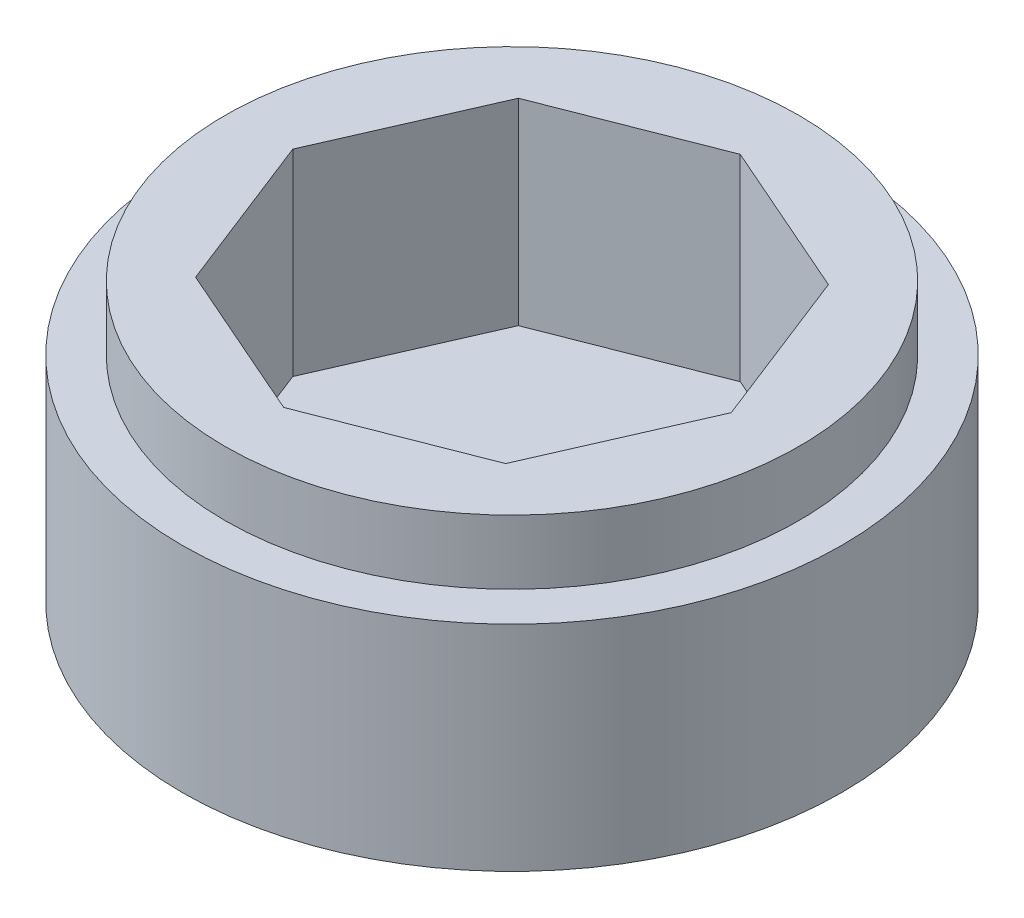
ISO-10303-21;
HEADER;
FILE_DESCRIPTION(('STEP AP214'),'2;1');
FILE_NAME('part.step','',(''),(''),'','','');
FILE_SCHEMA(('AUTOMOTIVE_DESIGN { 1 0 10303 214 1 1 1 1 }'));
ENDSEC;
DATA;
#1=APPLICATION_CONTEXT('core data for automotive mechanical design processes');
#2=APPLICATION_PROTOCOL_DEFINITION('international standard','automotive_design',2000,#1);
#3=PRODUCT_CONTEXT('',#1,'mechanical');
#4=PRODUCT('Part','Part','',(#3));
#5=PRODUCT_RELATED_PRODUCT_CATEGORY('part','',(#4));
#6=PRODUCT_DEFINITION_FORMATION('','',#4);
#7=PRODUCT_DEFINITION_CONTEXT('part definition',#1,'design');
#8=PRODUCT_DEFINITION('design','',#6,#7);
#9=PRODUCT_DEFINITION_SHAPE('','',#8);
#10=(LENGTH_UNIT() NAMED_UNIT(*) SI_UNIT(.MILLI.,.METRE.));
#11=(NAMED_UNIT(*) PLANE_ANGLE_UNIT() SI_UNIT($,.RADIAN.));
#12=(NAMED_UNIT(*) SI_UNIT($,.STERADIAN.) SOLID_ANGLE_UNIT());
#13=UNCERTAINTY_MEASURE_WITH_UNIT(LENGTH_MEASURE(1.E-05),#10,'distance_accuracy_value','');
#14=(GEOMETRIC_REPRESENTATION_CONTEXT(3) GLOBAL_UNCERTAINTY_ASSIGNED_CONTEXT((#13)) GLOBAL_UNIT_ASSIGNED_CONTEXT((#10,
#11,#12)) REPRESENTATION_CONTEXT('',''));
#15=CARTESIAN_POINT('',(0.,0.,0.));
#16=DIRECTION('',(0.,0.,1.));
#17=DIRECTION('',(1.,0.,0.));
#18=AXIS2_PLACEMENT_3D('',#15,#16,#17);
#19=CARTESIAN_POINT('',(0.,2.5,0.));
#20=DIRECTION('',(0.,-1.,0.));
#21=DIRECTION('',(0.,0.,-1.));
#22=AXIS2_PLACEMENT_3D('',#19,#20,#21);
#23=CYLINDRICAL_SURFACE('',#22,3.85);
#24=CARTESIAN_POINT('',(0.,2.5,0.));
#25=DIRECTION('',(0.,1.,0.));
#26=DIRECTION('',(0.,0.,1.));
#27=AXIS2_PLACEMENT_3D('',#24,#25,#26);
#28=CIRCLE('',#27,3.85);
#29=CARTESIAN_POINT('',(0.,2.5,3.85));
#30=VERTEX_POINT('',#29);
#31=EDGE_CURVE('E50',#30,#30,#28,.T.);
#32=ORIENTED_EDGE('',*,*,#31,.F.);
#33=EDGE_LOOP('',(#32));
#34=FACE_BOUND('',#33,.T.);
#35=CARTESIAN_POINT('',(0.,0.,0.));
#36=DIRECTION('',(0.,1.,0.));
#37=DIRECTION('',(0.,0.,1.));
#38=AXIS2_PLACEMENT_3D('',#35,#36,#37);
#39=CIRCLE('',#38,3.85);
#40=CARTESIAN_POINT('',(0.,0.,3.85));
#41=VERTEX_POINT('',#40);
#42=EDGE_CURVE('E44',#41,#41,#39,.T.);
#43=ORIENTED_EDGE('',*,*,#42,.T.);
#44=EDGE_LOOP('',(#43));
#45=FACE_BOUND('',#44,.T.);
#46=ADVANCED_FACE('F41',(#34,#45),#23,.T.);
#47=CARTESIAN_POINT('',(0.,2.5,0.));
#48=DIRECTION('',(0.,1.,0.));
#49=DIRECTION('',(0.,0.,1.));
#50=AXIS2_PLACEMENT_3D('',#47,#48,#49);
#51=PLANE('',#50);
#52=CARTESIAN_POINT('',(0.,2.5,0.));
#53=DIRECTION('',(0.,1.,0.));
#54=DIRECTION('',(0.,0.,1.));
#55=AXIS2_PLACEMENT_3D('',#52,#53,#54);
#56=CIRCLE('',#55,3.35);
#57=CARTESIAN_POINT('',(0.,2.5,3.35));
#58=VERTEX_POINT('',#57);
#59=EDGE_CURVE('E11',#58,#58,#56,.T.);
#60=ORIENTED_EDGE('',*,*,#59,.F.);
#61=EDGE_LOOP('',(#60));
#62=FACE_BOUND('',#61,.T.);
#63=ORIENTED_EDGE('',*,*,#31,.T.);
#64=EDGE_LOOP('',(#63));
#65=FACE_BOUND('',#64,.T.);
#66=ADVANCED_FACE('F207',(#62,#65),#51,.T.);
#67=CARTESIAN_POINT('',(0.,0.,0.));
#68=DIRECTION('',(0.,1.,0.));
#69=DIRECTION('',(0.,0.,1.));
#70=AXIS2_PLACEMENT_3D('',#67,#68,#69);
#71=PLANE('',#70);
#72=ORIENTED_EDGE('',*,*,#42,.F.);
#73=EDGE_LOOP('',(#72));
#74=FACE_BOUND('',#73,.T.);
#75=ADVANCED_FACE('F204',(#74),#71,.F.);
#76=CARTESIAN_POINT('',(0.,3.25,0.));
#77=DIRECTION('',(0.,-1.,0.));
#78=DIRECTION('',(0.,0.,-1.));
#79=AXIS2_PLACEMENT_3D('',#76,#77,#78);
#80=CYLINDRICAL_SURFACE('',#79,3.35);
#81=CARTESIAN_POINT('',(0.,3.25,0.));
#82=DIRECTION('',(0.,1.,0.));
#83=DIRECTION('',(0.,0.,1.));
#84=AXIS2_PLACEMENT_3D('',#81,#82,#83);
#85=CIRCLE('',#84,3.35);
#86=CARTESIAN_POINT('',(0.,3.25,3.35));
#87=VERTEX_POINT('',#86);
#88=EDGE_CURVE('E177',#87,#87,#85,.T.);
#89=ORIENTED_EDGE('',*,*,#88,.F.);
#90=EDGE_LOOP('',(#89));
#91=FACE_BOUND('',#90,.T.);
#92=ORIENTED_EDGE('',*,*,#59,.T.);
#93=EDGE_LOOP('',(#92));
#94=FACE_BOUND('',#93,.T.);
#95=ADVANCED_FACE('F206',(#91,#94),#80,.T.);
#96=CARTESIAN_POINT('',(0.,3.25,0.));
#97=DIRECTION('',(0.,1.,0.));
#98=DIRECTION('',(0.,0.,1.));
#99=AXIS2_PLACEMENT_3D('',#96,#97,#98);
#100=PLANE('',#99);
#101=DIRECTION('',(0.915986702905666,0.,0.401208624159561));
#102=VECTOR('',#101,1.);
#103=CARTESIAN_POINT('',(-1.88459000469273,3.25,1.81017889694871));
#104=LINE('',#103,#102);
#105=CARTESIAN_POINT('',(-1.88459000469273,3.25,1.81017889694871));
#106=VERTEX_POINT('',#105);
#107=CARTESIAN_POINT('',(-0.0526165988813971,3.25,2.61259614526784));
#108=VERTEX_POINT('',#107);
#109=EDGE_CURVE('E58',#106,#108,#104,.T.);
#110=ORIENTED_EDGE('',*,*,#109,.F.);
#111=DIRECTION('',(0.364003070287553,0.,0.931397747915054));
#112=VECTOR('',#111,1.);
#113=CARTESIAN_POINT('',(-2.61259614526784,3.25,-0.0526165988813964));
#114=LINE('',#113,#112);
#115=CARTESIAN_POINT('',(-2.61259614526784,3.25,-0.0526165988813964));
#116=VERTEX_POINT('',#115);
#117=EDGE_CURVE('E171',#116,#106,#114,.T.);
#118=ORIENTED_EDGE('',*,*,#117,.F.);
#119=DIRECTION('',(-0.401208624159561,0.,0.915986702905666));
#120=VECTOR('',#119,1.);
#121=CARTESIAN_POINT('',(-1.81017889694871,3.25,-1.88459000469273));
#122=LINE('',#121,#120);
#123=CARTESIAN_POINT('',(-1.81017889694871,3.25,-1.88459000469273));
#124=VERTEX_POINT('',#123);
#125=EDGE_CURVE('E168',#124,#116,#122,.T.);
#126=ORIENTED_EDGE('',*,*,#125,.F.);
#127=DIRECTION('',(-0.931397747915054,0.,0.364003070287554));
#128=VECTOR('',#127,1.);
#129=CARTESIAN_POINT('',(0.052616598881397,3.25,-2.61259614526784));
#130=LINE('',#129,#128);
#131=CARTESIAN_POINT('',(0.052616598881397,3.25,-2.61259614526784));
#132=VERTEX_POINT('',#131);
#133=EDGE_CURVE('E118',#132,#124,#130,.T.);
#134=ORIENTED_EDGE('',*,*,#133,.F.);
#135=DIRECTION('',(-0.915986702905666,0.,-0.401208624159561));
#136=VECTOR('',#135,1.);
#137=CARTESIAN_POINT('',(1.88459000469273,3.25,-1.81017889694871));
#138=LINE('',#137,#136);
#139=CARTESIAN_POINT('',(1.88459000469273,3.25,-1.81017889694871));
#140=VERTEX_POINT('',#139);
#141=EDGE_CURVE('E162',#140,#132,#138,.T.);
#142=ORIENTED_EDGE('',*,*,#141,.F.);
#143=DIRECTION('',(-0.364003070287553,0.,-0.931397747915054));
#144=VECTOR('',#143,1.);
#145=CARTESIAN_POINT('',(2.61259614526784,3.25,0.0526165988813964));
#146=LINE('',#145,#144);
#147=CARTESIAN_POINT('',(2.61259614526784,3.25,0.0526165988813964));
#148=VERTEX_POINT('',#147);
#149=EDGE_CURVE('E158',#148,#140,#146,.T.);
#150=ORIENTED_EDGE('',*,*,#149,.F.);
#151=DIRECTION('',(0.401208624159561,0.,-0.915986702905665));
#152=VECTOR('',#151,1.);
#153=CARTESIAN_POINT('',(1.81017889694871,3.25,1.88459000469273));
#154=LINE('',#153,#152);
#155=CARTESIAN_POINT('',(1.81017889694871,3.25,1.88459000469273));
#156=VERTEX_POINT('',#155);
#157=EDGE_CURVE('E154',#156,#148,#154,.T.);
#158=ORIENTED_EDGE('',*,*,#157,.F.);
#159=DIRECTION('',(0.931397747915054,0.,-0.364003070287553));
#160=VECTOR('',#159,1.);
#161=CARTESIAN_POINT('',(-0.0526165988813971,3.25,2.61259614526784));
#162=LINE('',#161,#160);
#163=EDGE_CURVE('E150',#108,#156,#162,.T.);
#164=ORIENTED_EDGE('',*,*,#163,.F.);
#165=EDGE_LOOP('',(#110,#118,#126,#134,#142,#150,#158,#164));
#166=FACE_BOUND('',#165,.T.);
#167=ORIENTED_EDGE('',*,*,#88,.T.);
#168=EDGE_LOOP('',(#167));
#169=FACE_BOUND('',#168,.T.);
#170=ADVANCED_FACE('F212',(#166,#169),#100,.T.);
#171=CARTESIAN_POINT('',(-1.88459000469273,0.95,1.81017889694871));
#172=DIRECTION('',(-0.401208624159561,0.,0.915986702905666));
#173=DIRECTION('',(0.915986702905666,0.,0.401208624159561));
#174=AXIS2_PLACEMENT_3D('',#171,#172,#173);
#175=PLANE('',#174);
#176=ORIENTED_EDGE('',*,*,#109,.T.);
#177=DIRECTION('',(0.,1.,0.));
#178=VECTOR('',#177,1.);
#179=CARTESIAN_POINT('',(-0.0526165988813971,0.95,2.61259614526784));
#180=LINE('',#179,#178);
#181=CARTESIAN_POINT('',(-0.0526165988813971,0.95,2.61259614526784));
#182=VERTEX_POINT('',#181);
#183=EDGE_CURVE('E94',#182,#108,#180,.T.);
#184=ORIENTED_EDGE('',*,*,#183,.F.);
#185=DIRECTION('',(0.915986702905666,0.,0.401208624159561));
#186=VECTOR('',#185,1.);
#187=CARTESIAN_POINT('',(-1.88459000469273,0.95,1.81017889694871));
#188=LINE('',#187,#186);
#189=CARTESIAN_POINT('',(-1.88459000469273,0.95,1.81017889694871));
#190=VERTEX_POINT('',#189);
#191=EDGE_CURVE('E174',#190,#182,#188,.T.);
#192=ORIENTED_EDGE('',*,*,#191,.F.);
#193=DIRECTION('',(0.,1.,0.));
#194=VECTOR('',#193,1.);
#195=CARTESIAN_POINT('',(-1.88459000469273,0.95,1.81017889694871));
#196=LINE('',#195,#194);
#197=EDGE_CURVE('E66',#190,#106,#196,.T.);
#198=ORIENTED_EDGE('',*,*,#197,.T.);
#199=EDGE_LOOP('',(#176,#184,#192,#198));
#200=FACE_BOUND('',#199,.T.);
#201=ADVANCED_FACE('F242',(#200),#175,.F.);
#202=CARTESIAN_POINT('',(-2.61259614526784,0.95,-0.0526165988813964));
#203=DIRECTION('',(-0.931397747915054,0.,0.364003070287553));
#204=DIRECTION('',(0.364003070287553,0.,0.931397747915054));
#205=AXIS2_PLACEMENT_3D('',#202,#203,#204);
#206=PLANE('',#205);
#207=ORIENTED_EDGE('',*,*,#117,.T.);
#208=ORIENTED_EDGE('',*,*,#197,.F.);
#209=DIRECTION('',(0.364003070287553,0.,0.931397747915054));
#210=VECTOR('',#209,1.);
#211=CARTESIAN_POINT('',(-2.61259614526784,0.95,-0.0526165988813964));
#212=LINE('',#211,#210);
#213=CARTESIAN_POINT('',(-2.61259614526784,0.95,-0.0526165988813964));
#214=VERTEX_POINT('',#213);
#215=EDGE_CURVE('E132',#214,#190,#212,.T.);
#216=ORIENTED_EDGE('',*,*,#215,.F.);
#217=DIRECTION('',(0.,1.,0.));
#218=VECTOR('',#217,1.);
#219=CARTESIAN_POINT('',(-2.61259614526784,0.95,-0.0526165988813964));
#220=LINE('',#219,#218);
#221=EDGE_CURVE('E123',#214,#116,#220,.T.);
#222=ORIENTED_EDGE('',*,*,#221,.T.);
#223=EDGE_LOOP('',(#207,#208,#216,#222));
#224=FACE_BOUND('',#223,.T.);
#225=ADVANCED_FACE('F252',(#224),#206,.F.);
#226=CARTESIAN_POINT('',(-1.81017889694871,0.95,-1.88459000469273));
#227=DIRECTION('',(-0.915986702905666,0.,-0.401208624159561));
#228=DIRECTION('',(-0.401208624159561,0.,0.915986702905666));
#229=AXIS2_PLACEMENT_3D('',#226,#227,#228);
#230=PLANE('',#229);
#231=ORIENTED_EDGE('',*,*,#125,.T.);
#232=ORIENTED_EDGE('',*,*,#221,.F.);
#233=DIRECTION('',(-0.401208624159561,0.,0.915986702905666));
#234=VECTOR('',#233,1.);
#235=CARTESIAN_POINT('',(-1.81017889694871,0.95,-1.88459000469273));
#236=LINE('',#235,#234);
#237=CARTESIAN_POINT('',(-1.81017889694871,0.95,-1.88459000469273));
#238=VERTEX_POINT('',#237);
#239=EDGE_CURVE('E127',#238,#214,#236,.T.);
#240=ORIENTED_EDGE('',*,*,#239,.F.);
#241=DIRECTION('',(0.,1.,0.));
#242=VECTOR('',#241,1.);
#243=CARTESIAN_POINT('',(-1.81017889694871,0.95,-1.88459000469273));
#244=LINE('',#243,#242);
#245=EDGE_CURVE('E111',#238,#124,#244,.T.);
#246=ORIENTED_EDGE('',*,*,#245,.T.);
#247=EDGE_LOOP('',(#231,#232,#240,#246));
#248=FACE_BOUND('',#247,.T.);
#249=ADVANCED_FACE('F128',(#248),#230,.F.);
#250=CARTESIAN_POINT('',(0.052616598881397,0.95,-2.61259614526784));
#251=DIRECTION('',(-0.364003070287554,0.,-0.931397747915054));
#252=DIRECTION('',(-0.931397747915054,0.,0.364003070287554));
#253=AXIS2_PLACEMENT_3D('',#250,#251,#252);
#254=PLANE('',#253);
#255=ORIENTED_EDGE('',*,*,#133,.T.);
#256=ORIENTED_EDGE('',*,*,#245,.F.);
#257=DIRECTION('',(-0.931397747915054,0.,0.364003070287554));
#258=VECTOR('',#257,1.);
#259=CARTESIAN_POINT('',(0.052616598881397,0.95,-2.61259614526784));
#260=LINE('',#259,#258);
#261=CARTESIAN_POINT('',(0.052616598881397,0.95,-2.61259614526784));
#262=VERTEX_POINT('',#261);
#263=EDGE_CURVE('E115',#262,#238,#260,.T.);
#264=ORIENTED_EDGE('',*,*,#263,.F.);
#265=DIRECTION('',(0.,1.,0.));
#266=VECTOR('',#265,1.);
#267=CARTESIAN_POINT('',(0.052616598881397,0.95,-2.61259614526784));
#268=LINE('',#267,#266);
#269=EDGE_CURVE('E124',#262,#132,#268,.T.);
#270=ORIENTED_EDGE('',*,*,#269,.T.);
#271=EDGE_LOOP('',(#255,#256,#264,#270));
#272=FACE_BOUND('',#271,.T.);
#273=ADVANCED_FACE('F113',(#272),#254,.F.);
#274=CARTESIAN_POINT('',(1.88459000469273,0.95,-1.81017889694871));
#275=DIRECTION('',(0.401208624159561,0.,-0.915986702905666));
#276=DIRECTION('',(-0.915986702905666,0.,-0.401208624159561));
#277=AXIS2_PLACEMENT_3D('',#274,#275,#276);
#278=PLANE('',#277);
#279=ORIENTED_EDGE('',*,*,#141,.T.);
#280=ORIENTED_EDGE('',*,*,#269,.F.);
#281=DIRECTION('',(-0.915986702905666,0.,-0.401208624159561));
#282=VECTOR('',#281,1.);
#283=CARTESIAN_POINT('',(1.88459000469273,0.95,-1.81017889694871));
#284=LINE('',#283,#282);
#285=CARTESIAN_POINT('',(1.88459000469273,0.95,-1.81017889694871));
#286=VERTEX_POINT('',#285);
#287=EDGE_CURVE('E138',#286,#262,#284,.T.);
#288=ORIENTED_EDGE('',*,*,#287,.F.);
#289=DIRECTION('',(0.,1.,0.));
#290=VECTOR('',#289,1.);
#291=CARTESIAN_POINT('',(1.88459000469273,0.95,-1.81017889694871));
#292=LINE('',#291,#290);
#293=EDGE_CURVE('E182',#286,#140,#292,.T.);
#294=ORIENTED_EDGE('',*,*,#293,.T.);
#295=EDGE_LOOP('',(#279,#280,#288,#294));
#296=FACE_BOUND('',#295,.T.);
#297=ADVANCED_FACE('F277',(#296),#278,.F.);
#298=CARTESIAN_POINT('',(2.61259614526784,0.95,0.0526165988813964));
#299=DIRECTION('',(0.931397747915054,0.,-0.364003070287553));
#300=DIRECTION('',(-0.364003070287553,0.,-0.931397747915054));
#301=AXIS2_PLACEMENT_3D('',#298,#299,#300);
#302=PLANE('',#301);
#303=ORIENTED_EDGE('',*,*,#149,.T.);
#304=ORIENTED_EDGE('',*,*,#293,.F.);
#305=DIRECTION('',(-0.364003070287553,0.,-0.931397747915054));
#306=VECTOR('',#305,1.);
#307=CARTESIAN_POINT('',(2.61259614526784,0.95,0.0526165988813964));
#308=LINE('',#307,#306);
#309=CARTESIAN_POINT('',(2.61259614526784,0.95,0.0526165988813964));
#310=VERTEX_POINT('',#309);
#311=EDGE_CURVE('E142',#310,#286,#308,.T.);
#312=ORIENTED_EDGE('',*,*,#311,.F.);
#313=DIRECTION('',(0.,1.,0.));
#314=VECTOR('',#313,1.);
#315=CARTESIAN_POINT('',(2.61259614526784,0.95,0.0526165988813964));
#316=LINE('',#315,#314);
#317=EDGE_CURVE('E185',#310,#148,#316,.T.);
#318=ORIENTED_EDGE('',*,*,#317,.T.);
#319=EDGE_LOOP('',(#303,#304,#312,#318));
#320=FACE_BOUND('',#319,.T.);
#321=ADVANCED_FACE('F286',(#320),#302,.F.);
#322=CARTESIAN_POINT('',(1.81017889694871,0.95,1.88459000469273));
#323=DIRECTION('',(0.915986702905666,0.,0.401208624159561));
#324=DIRECTION('',(0.401208624159561,0.,-0.915986702905666));
#325=AXIS2_PLACEMENT_3D('',#322,#323,#324);
#326=PLANE('',#325);
#327=ORIENTED_EDGE('',*,*,#157,.T.);
#328=ORIENTED_EDGE('',*,*,#317,.F.);
#329=DIRECTION('',(0.401208624159561,0.,-0.915986702905665));
#330=VECTOR('',#329,1.);
#331=CARTESIAN_POINT('',(1.81017889694871,0.95,1.88459000469273));
#332=LINE('',#331,#330);
#333=CARTESIAN_POINT('',(1.81017889694871,0.95,1.88459000469273));
#334=VERTEX_POINT('',#333);
#335=EDGE_CURVE('E336',#334,#310,#332,.T.);
#336=ORIENTED_EDGE('',*,*,#335,.F.);
#337=DIRECTION('',(0.,1.,0.));
#338=VECTOR('',#337,1.);
#339=CARTESIAN_POINT('',(1.81017889694871,0.95,1.88459000469273));
#340=LINE('',#339,#338);
#341=EDGE_CURVE('E188',#334,#156,#340,.T.);
#342=ORIENTED_EDGE('',*,*,#341,.T.);
#343=EDGE_LOOP('',(#327,#328,#336,#342));
#344=FACE_BOUND('',#343,.T.);
#345=ADVANCED_FACE('F296',(#344),#326,.F.);
#346=CARTESIAN_POINT('',(-0.0526165988813971,0.95,2.61259614526784));
#347=DIRECTION('',(0.364003070287553,0.,0.931397747915054));
#348=DIRECTION('',(0.931397747915054,0.,-0.364003070287553));
#349=AXIS2_PLACEMENT_3D('',#346,#347,#348);
#350=PLANE('',#349);
#351=ORIENTED_EDGE('',*,*,#163,.T.);
#352=ORIENTED_EDGE('',*,*,#341,.F.);
#353=DIRECTION('',(0.931397747915054,0.,-0.364003070287553));
#354=VECTOR('',#353,1.);
#355=CARTESIAN_POINT('',(-0.0526165988813971,0.95,2.61259614526784));
#356=LINE('',#355,#354);
#357=EDGE_CURVE('E339',#182,#334,#356,.T.);
#358=ORIENTED_EDGE('',*,*,#357,.F.);
#359=ORIENTED_EDGE('',*,*,#183,.T.);
#360=EDGE_LOOP('',(#351,#352,#358,#359));
#361=FACE_BOUND('',#360,.T.);
#362=ADVANCED_FACE('F306',(#361),#350,.F.);
#363=CARTESIAN_POINT('',(0.,0.95,0.));
#364=DIRECTION('',(0.,1.,0.));
#365=DIRECTION('',(0.,0.,1.));
#366=AXIS2_PLACEMENT_3D('',#363,#364,#365);
#367=PLANE('',#366);
#368=ORIENTED_EDGE('',*,*,#191,.T.);
#369=ORIENTED_EDGE('',*,*,#357,.T.);
#370=ORIENTED_EDGE('',*,*,#335,.T.);
#371=ORIENTED_EDGE('',*,*,#311,.T.);
#372=ORIENTED_EDGE('',*,*,#287,.T.);
#373=ORIENTED_EDGE('',*,*,#263,.T.);
#374=ORIENTED_EDGE('',*,*,#239,.T.);
#375=ORIENTED_EDGE('',*,*,#215,.T.);
#376=EDGE_LOOP('',(#368,#369,#370,#371,#372,#373,#374,#375));
#377=FACE_BOUND('',#376,.T.);
#378=ADVANCED_FACE('F135',(#377),#367,.T.);
#379=CLOSED_SHELL('',(#46,#66,#75,#95,#170,#201,#225,#249,#273,#297,#321,#345,#362,#378));
#380=MANIFOLD_SOLID_BREP('B2',#379);
#381=ADVANCED_BREP_SHAPE_REPRESENTATION('',(#18,#380),#14);
#382=SHAPE_DEFINITION_REPRESENTATION(#9,#381);
ENDSEC;
END-ISO-10303-21;
